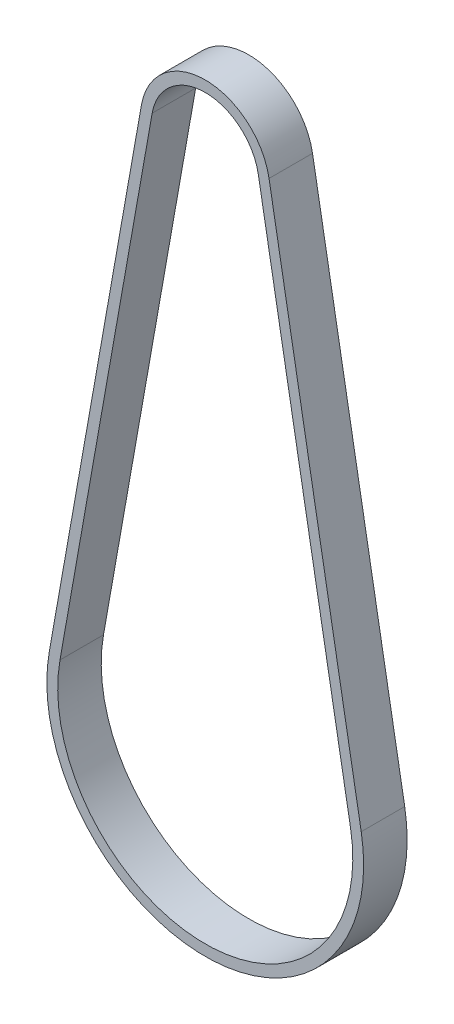
ISO-10303-21;
HEADER;
FILE_DESCRIPTION(('STEP AP214'),'2;1');
FILE_NAME('part.step','',(''),(''),'','','');
FILE_SCHEMA(('AUTOMOTIVE_DESIGN { 1 0 10303 214 1 1 1 1 }'));
ENDSEC;
DATA;
#1=APPLICATION_CONTEXT('core data for automotive mechanical design processes');
#2=APPLICATION_PROTOCOL_DEFINITION('international standard','automotive_design',2000,#1);
#3=PRODUCT_CONTEXT('',#1,'mechanical');
#4=PRODUCT('Part','Part','',(#3));
#5=PRODUCT_RELATED_PRODUCT_CATEGORY('part','',(#4));
#6=PRODUCT_DEFINITION_FORMATION('','',#4);
#7=PRODUCT_DEFINITION_CONTEXT('part definition',#1,'design');
#8=PRODUCT_DEFINITION('design','',#6,#7);
#9=PRODUCT_DEFINITION_SHAPE('','',#8);
#10=(LENGTH_UNIT() NAMED_UNIT(*) SI_UNIT(.MILLI.,.METRE.));
#11=(NAMED_UNIT(*) PLANE_ANGLE_UNIT() SI_UNIT($,.RADIAN.));
#12=(NAMED_UNIT(*) SI_UNIT($,.STERADIAN.) SOLID_ANGLE_UNIT());
#13=UNCERTAINTY_MEASURE_WITH_UNIT(LENGTH_MEASURE(1.E-05),#10,'distance_accuracy_value','');
#14=(GEOMETRIC_REPRESENTATION_CONTEXT(3) GLOBAL_UNCERTAINTY_ASSIGNED_CONTEXT((#13)) GLOBAL_UNIT_ASSIGNED_CONTEXT((#10,
#11,#12)) REPRESENTATION_CONTEXT('',''));
#15=CARTESIAN_POINT('',(0.,0.,0.));
#16=DIRECTION('',(0.,0.,1.));
#17=DIRECTION('',(1.,0.,0.));
#18=AXIS2_PLACEMENT_3D('',#15,#16,#17);
#19=CARTESIAN_POINT('',(0.,-73.929239836619,6.));
#20=DIRECTION('',(0.,0.,1.));
#21=DIRECTION('',(1.,0.,0.));
#22=AXIS2_PLACEMENT_3D('',#19,#20,#21);
#23=PLANE('',#22);
#24=CARTESIAN_POINT('',(0.,-73.929239836619,6.));
#25=DIRECTION('',(0.,0.,1.));
#26=DIRECTION('',(-1.,0.,0.));
#27=AXIS2_PLACEMENT_3D('',#24,#25,#26);
#28=CIRCLE('',#27,21.85);
#29=CARTESIAN_POINT('',(-21.5140073220577,-70.1121743477322,6.));
#30=VERTEX_POINT('',#29);
#31=CARTESIAN_POINT('',(21.5140073220576,-70.1121743477322,6.));
#32=VERTEX_POINT('',#31);
#33=EDGE_CURVE('E158',#30,#32,#28,.T.);
#34=ORIENTED_EDGE('',*,*,#33,.T.);
#35=DIRECTION('',(-0.174694072717935,0.984622760734902,0.));
#36=VECTOR('',#35,1.);
#37=CARTESIAN_POINT('',(8.79760436716634,1.56089153973475,6.));
#38=LINE('',#37,#36);
#39=CARTESIAN_POINT('',(8.79760436716634,1.56089153973475,6.));
#40=VERTEX_POINT('',#39);
#41=EDGE_CURVE('E161',#32,#40,#38,.T.);
#42=ORIENTED_EDGE('',*,*,#41,.T.);
#43=CARTESIAN_POINT('',(0.,0.,6.));
#44=DIRECTION('',(0.,0.,1.));
#45=DIRECTION('',(-1.,0.,0.));
#46=AXIS2_PLACEMENT_3D('',#43,#44,#45);
#47=CIRCLE('',#46,8.935);
#48=CARTESIAN_POINT('',(-8.79760436716636,1.56089153973475,6.));
#49=VERTEX_POINT('',#48);
#50=EDGE_CURVE('E164',#40,#49,#47,.T.);
#51=ORIENTED_EDGE('',*,*,#50,.T.);
#52=DIRECTION('',(-0.174694072717936,-0.984622760734902,0.));
#53=VECTOR('',#52,1.);
#54=CARTESIAN_POINT('',(-21.5140073220577,-70.1121743477322,6.));
#55=LINE('',#54,#53);
#56=EDGE_CURVE('E166',#49,#30,#55,.T.);
#57=ORIENTED_EDGE('',*,*,#56,.T.);
#58=EDGE_LOOP('',(#34,#42,#51,#57));
#59=FACE_BOUND('',#58,.T.);
#60=DIRECTION('',(-0.174694072717935,0.984622760734903,0.));
#61=VECTOR('',#60,1.);
#62=CARTESIAN_POINT('',(20.0370731809552,-70.3742154568091,6.));
#63=LINE('',#62,#61);
#64=CARTESIAN_POINT('',(20.0370731809552,-70.3742154568091,6.));
#65=VERTEX_POINT('',#64);
#66=CARTESIAN_POINT('',(7.32067022606399,1.29885043065785,6.));
#67=VERTEX_POINT('',#66);
#68=EDGE_CURVE('E130',#65,#67,#63,.T.);
#69=ORIENTED_EDGE('',*,*,#68,.F.);
#70=CARTESIAN_POINT('',(0.,-73.929239836619,6.));
#71=DIRECTION('',(0.,0.,-1.));
#72=DIRECTION('',(-1.,0.,0.));
#73=AXIS2_PLACEMENT_3D('',#70,#71,#72);
#74=CIRCLE('',#73,20.35);
#75=CARTESIAN_POINT('',(-20.0370731809553,-70.3742154568091,6.));
#76=VERTEX_POINT('',#75);
#77=EDGE_CURVE('E122',#76,#65,#74,.F.);
#78=ORIENTED_EDGE('',*,*,#77,.F.);
#79=DIRECTION('',(-0.174694072717936,-0.984622760734902,0.));
#80=VECTOR('',#79,1.);
#81=CARTESIAN_POINT('',(-20.0370731809553,-70.3742154568091,6.));
#82=LINE('',#81,#80);
#83=CARTESIAN_POINT('',(-7.32067022606401,1.29885043065786,6.));
#84=VERTEX_POINT('',#83);
#85=EDGE_CURVE('E144',#84,#76,#82,.T.);
#86=ORIENTED_EDGE('',*,*,#85,.F.);
#87=CARTESIAN_POINT('',(0.,0.,6.));
#88=DIRECTION('',(0.,0.,-1.));
#89=DIRECTION('',(-1.,0.,0.));
#90=AXIS2_PLACEMENT_3D('',#87,#88,#89);
#91=CIRCLE('',#90,7.435);
#92=EDGE_CURVE('E142',#67,#84,#91,.F.);
#93=ORIENTED_EDGE('',*,*,#92,.F.);
#94=EDGE_LOOP('',(#69,#78,#86,#93));
#95=FACE_BOUND('',#94,.T.);
#96=ADVANCED_FACE('F57',(#59,#95),#23,.T.);
#97=CARTESIAN_POINT('',(0.,-73.929239836619,0.));
#98=DIRECTION('',(0.,0.,1.));
#99=DIRECTION('',(1.,0.,0.));
#100=AXIS2_PLACEMENT_3D('',#97,#98,#99);
#101=PLANE('',#100);
#102=CARTESIAN_POINT('',(0.,-73.929239836619,0.));
#103=DIRECTION('',(0.,0.,1.));
#104=DIRECTION('',(-1.,0.,0.));
#105=AXIS2_PLACEMENT_3D('',#102,#103,#104);
#106=CIRCLE('',#105,21.85);
#107=CARTESIAN_POINT('',(-21.5140073220577,-70.1121743477322,0.));
#108=VERTEX_POINT('',#107);
#109=CARTESIAN_POINT('',(21.5140073220576,-70.1121743477322,0.));
#110=VERTEX_POINT('',#109);
#111=EDGE_CURVE('E138',#108,#110,#106,.T.);
#112=ORIENTED_EDGE('',*,*,#111,.F.);
#113=DIRECTION('',(-0.174694072717936,-0.984622760734902,0.));
#114=VECTOR('',#113,1.);
#115=CARTESIAN_POINT('',(-21.5140073220577,-70.1121743477322,0.));
#116=LINE('',#115,#114);
#117=CARTESIAN_POINT('',(-8.79760436716636,1.56089153973475,0.));
#118=VERTEX_POINT('',#117);
#119=EDGE_CURVE('E162',#118,#108,#116,.T.);
#120=ORIENTED_EDGE('',*,*,#119,.F.);
#121=CARTESIAN_POINT('',(0.,0.,0.));
#122=DIRECTION('',(0.,0.,1.));
#123=DIRECTION('',(-1.,0.,0.));
#124=AXIS2_PLACEMENT_3D('',#121,#122,#123);
#125=CIRCLE('',#124,8.935);
#126=CARTESIAN_POINT('',(8.79760436716634,1.56089153973475,0.));
#127=VERTEX_POINT('',#126);
#128=EDGE_CURVE('E173',#127,#118,#125,.T.);
#129=ORIENTED_EDGE('',*,*,#128,.F.);
#130=DIRECTION('',(-0.174694072717935,0.984622760734902,0.));
#131=VECTOR('',#130,1.);
#132=CARTESIAN_POINT('',(8.79760436716634,1.56089153973475,0.));
#133=LINE('',#132,#131);
#134=EDGE_CURVE('E171',#110,#127,#133,.T.);
#135=ORIENTED_EDGE('',*,*,#134,.F.);
#136=EDGE_LOOP('',(#112,#120,#129,#135));
#137=FACE_BOUND('',#136,.T.);
#138=CARTESIAN_POINT('',(0.,-73.929239836619,0.));
#139=DIRECTION('',(0.,0.,-1.));
#140=DIRECTION('',(-1.,0.,0.));
#141=AXIS2_PLACEMENT_3D('',#138,#139,#140);
#142=CIRCLE('',#141,20.35);
#143=CARTESIAN_POINT('',(-20.0370731809553,-70.3742154568091,0.));
#144=VERTEX_POINT('',#143);
#145=CARTESIAN_POINT('',(20.0370731809552,-70.3742154568091,0.));
#146=VERTEX_POINT('',#145);
#147=EDGE_CURVE('E80',#144,#146,#142,.F.);
#148=ORIENTED_EDGE('',*,*,#147,.T.);
#149=DIRECTION('',(-0.174694072717935,0.984622760734903,0.));
#150=VECTOR('',#149,1.);
#151=CARTESIAN_POINT('',(20.0370731809552,-70.3742154568091,0.));
#152=LINE('',#151,#150);
#153=CARTESIAN_POINT('',(7.32067022606399,1.29885043065785,0.));
#154=VERTEX_POINT('',#153);
#155=EDGE_CURVE('E137',#146,#154,#152,.T.);
#156=ORIENTED_EDGE('',*,*,#155,.T.);
#157=CARTESIAN_POINT('',(0.,0.,0.));
#158=DIRECTION('',(0.,0.,-1.));
#159=DIRECTION('',(-1.,0.,0.));
#160=AXIS2_PLACEMENT_3D('',#157,#158,#159);
#161=CIRCLE('',#160,7.435);
#162=CARTESIAN_POINT('',(-7.32067022606401,1.29885043065785,0.));
#163=VERTEX_POINT('',#162);
#164=EDGE_CURVE('E150',#154,#163,#161,.F.);
#165=ORIENTED_EDGE('',*,*,#164,.T.);
#166=DIRECTION('',(-0.174694072717936,-0.984622760734902,0.));
#167=VECTOR('',#166,1.);
#168=CARTESIAN_POINT('',(-20.0370731809553,-70.3742154568091,0.));
#169=LINE('',#168,#167);
#170=EDGE_CURVE('E131',#163,#144,#169,.T.);
#171=ORIENTED_EDGE('',*,*,#170,.T.);
#172=EDGE_LOOP('',(#148,#156,#165,#171));
#173=FACE_BOUND('',#172,.T.);
#174=ADVANCED_FACE('F191',(#137,#173),#101,.F.);
#175=CARTESIAN_POINT('',(0.,-73.929239836619,6.));
#176=DIRECTION('',(0.,0.,-1.));
#177=DIRECTION('',(-1.,0.,0.));
#178=AXIS2_PLACEMENT_3D('',#175,#176,#177);
#179=CYLINDRICAL_SURFACE('',#178,21.85);
#180=ORIENTED_EDGE('',*,*,#111,.T.);
#181=DIRECTION('',(0.,0.,-1.));
#182=VECTOR('',#181,1.);
#183=CARTESIAN_POINT('',(21.5140073220576,-70.1121743477322,6.));
#184=LINE('',#183,#182);
#185=EDGE_CURVE('E12',#32,#110,#184,.T.);
#186=ORIENTED_EDGE('',*,*,#185,.F.);
#187=ORIENTED_EDGE('',*,*,#33,.F.);
#188=DIRECTION('',(0.,0.,-1.));
#189=VECTOR('',#188,1.);
#190=CARTESIAN_POINT('',(-21.5140073220577,-70.1121743477322,6.));
#191=LINE('',#190,#189);
#192=EDGE_CURVE('E168',#30,#108,#191,.T.);
#193=ORIENTED_EDGE('',*,*,#192,.T.);
#194=EDGE_LOOP('',(#180,#186,#187,#193));
#195=FACE_BOUND('',#194,.T.);
#196=ADVANCED_FACE('F59',(#195),#179,.T.);
#197=CARTESIAN_POINT('',(8.79760436716634,1.56089153973475,6.));
#198=DIRECTION('',(-0.984622760734903,-0.174694072717935,0.));
#199=DIRECTION('',(0.174694072717935,-0.984622760734903,0.));
#200=AXIS2_PLACEMENT_3D('',#197,#198,#199);
#201=PLANE('',#200);
#202=ORIENTED_EDGE('',*,*,#134,.T.);
#203=DIRECTION('',(0.,0.,-1.));
#204=VECTOR('',#203,1.);
#205=CARTESIAN_POINT('',(8.79760436716634,1.56089153973475,6.));
#206=LINE('',#205,#204);
#207=EDGE_CURVE('E65',#40,#127,#206,.T.);
#208=ORIENTED_EDGE('',*,*,#207,.F.);
#209=ORIENTED_EDGE('',*,*,#41,.F.);
#210=ORIENTED_EDGE('',*,*,#185,.T.);
#211=EDGE_LOOP('',(#202,#208,#209,#210));
#212=FACE_BOUND('',#211,.T.);
#213=ADVANCED_FACE('F201',(#212),#201,.F.);
#214=CARTESIAN_POINT('',(0.,0.,6.));
#215=DIRECTION('',(0.,0.,-1.));
#216=DIRECTION('',(-1.,0.,0.));
#217=AXIS2_PLACEMENT_3D('',#214,#215,#216);
#218=CYLINDRICAL_SURFACE('',#217,8.935);
#219=ORIENTED_EDGE('',*,*,#128,.T.);
#220=DIRECTION('',(0.,0.,-1.));
#221=VECTOR('',#220,1.);
#222=CARTESIAN_POINT('',(-8.79760436716636,1.56089153973475,6.));
#223=LINE('',#222,#221);
#224=EDGE_CURVE('E178',#49,#118,#223,.T.);
#225=ORIENTED_EDGE('',*,*,#224,.F.);
#226=ORIENTED_EDGE('',*,*,#50,.F.);
#227=ORIENTED_EDGE('',*,*,#207,.T.);
#228=EDGE_LOOP('',(#219,#225,#226,#227));
#229=FACE_BOUND('',#228,.T.);
#230=ADVANCED_FACE('F185',(#229),#218,.T.);
#231=CARTESIAN_POINT('',(-21.5140073220577,-70.1121743477322,6.));
#232=DIRECTION('',(0.984622760734902,-0.174694072717936,0.));
#233=DIRECTION('',(0.174694072717936,0.984622760734902,0.));
#234=AXIS2_PLACEMENT_3D('',#231,#232,#233);
#235=PLANE('',#234);
#236=ORIENTED_EDGE('',*,*,#119,.T.);
#237=ORIENTED_EDGE('',*,*,#192,.F.);
#238=ORIENTED_EDGE('',*,*,#56,.F.);
#239=ORIENTED_EDGE('',*,*,#224,.T.);
#240=EDGE_LOOP('',(#236,#237,#238,#239));
#241=FACE_BOUND('',#240,.T.);
#242=ADVANCED_FACE('F195',(#241),#235,.F.);
#243=CARTESIAN_POINT('',(0.,-73.929239836619,6.));
#244=DIRECTION('',(0.,0.,-1.));
#245=DIRECTION('',(-1.,0.,0.));
#246=AXIS2_PLACEMENT_3D('',#243,#244,#245);
#247=CYLINDRICAL_SURFACE('',#246,20.35);
#248=ORIENTED_EDGE('',*,*,#147,.F.);
#249=DIRECTION('',(0.,0.,-1.));
#250=VECTOR('',#249,1.);
#251=CARTESIAN_POINT('',(-20.0370731809553,-70.3742154568091,6.));
#252=LINE('',#251,#250);
#253=EDGE_CURVE('E126',#76,#144,#252,.T.);
#254=ORIENTED_EDGE('',*,*,#253,.F.);
#255=ORIENTED_EDGE('',*,*,#77,.T.);
#256=DIRECTION('',(0.,0.,-1.));
#257=VECTOR('',#256,1.);
#258=CARTESIAN_POINT('',(20.0370731809552,-70.3742154568091,6.));
#259=LINE('',#258,#257);
#260=EDGE_CURVE('E125',#65,#146,#259,.T.);
#261=ORIENTED_EDGE('',*,*,#260,.T.);
#262=EDGE_LOOP('',(#248,#254,#255,#261));
#263=FACE_BOUND('',#262,.T.);
#264=ADVANCED_FACE('F124',(#263),#247,.F.);
#265=CARTESIAN_POINT('',(20.0370731809552,-70.3742154568091,6.));
#266=DIRECTION('',(-0.984622760734902,-0.174694072717935,0.));
#267=DIRECTION('',(0.174694072717935,-0.984622760734903,0.));
#268=AXIS2_PLACEMENT_3D('',#265,#266,#267);
#269=PLANE('',#268);
#270=ORIENTED_EDGE('',*,*,#155,.F.);
#271=ORIENTED_EDGE('',*,*,#260,.F.);
#272=ORIENTED_EDGE('',*,*,#68,.T.);
#273=DIRECTION('',(0.,0.,-1.));
#274=VECTOR('',#273,1.);
#275=CARTESIAN_POINT('',(7.32067022606399,1.29885043065785,6.));
#276=LINE('',#275,#274);
#277=EDGE_CURVE('E139',#67,#154,#276,.T.);
#278=ORIENTED_EDGE('',*,*,#277,.T.);
#279=EDGE_LOOP('',(#270,#271,#272,#278));
#280=FACE_BOUND('',#279,.T.);
#281=ADVANCED_FACE('F134',(#280),#269,.T.);
#282=CARTESIAN_POINT('',(0.,0.,6.));
#283=DIRECTION('',(0.,0.,-1.));
#284=DIRECTION('',(-1.,0.,0.));
#285=AXIS2_PLACEMENT_3D('',#282,#283,#284);
#286=CYLINDRICAL_SURFACE('',#285,7.435);
#287=ORIENTED_EDGE('',*,*,#164,.F.);
#288=ORIENTED_EDGE('',*,*,#277,.F.);
#289=ORIENTED_EDGE('',*,*,#92,.T.);
#290=DIRECTION('',(0.,0.,-1.));
#291=VECTOR('',#290,1.);
#292=CARTESIAN_POINT('',(-7.32067022606401,1.29885043065785,6.));
#293=LINE('',#292,#291);
#294=EDGE_CURVE('E72',#84,#163,#293,.T.);
#295=ORIENTED_EDGE('',*,*,#294,.T.);
#296=EDGE_LOOP('',(#287,#288,#289,#295));
#297=FACE_BOUND('',#296,.T.);
#298=ADVANCED_FACE('F224',(#297),#286,.F.);
#299=CARTESIAN_POINT('',(-20.0370731809553,-70.3742154568091,6.));
#300=DIRECTION('',(0.984622760734902,-0.174694072717936,0.));
#301=DIRECTION('',(0.174694072717936,0.984622760734902,0.));
#302=AXIS2_PLACEMENT_3D('',#299,#300,#301);
#303=PLANE('',#302);
#304=ORIENTED_EDGE('',*,*,#170,.F.);
#305=ORIENTED_EDGE('',*,*,#294,.F.);
#306=ORIENTED_EDGE('',*,*,#85,.T.);
#307=ORIENTED_EDGE('',*,*,#253,.T.);
#308=EDGE_LOOP('',(#304,#305,#306,#307));
#309=FACE_BOUND('',#308,.T.);
#310=ADVANCED_FACE('F228',(#309),#303,.T.);
#311=CLOSED_SHELL('',(#96,#174,#196,#213,#230,#242,#264,#281,#298,#310));
#312=MANIFOLD_SOLID_BREP('B2',#311);
#313=ADVANCED_BREP_SHAPE_REPRESENTATION('',(#18,#312),#14);
#314=SHAPE_DEFINITION_REPRESENTATION(#9,#313);
ENDSEC;
END-ISO-10303-21;
